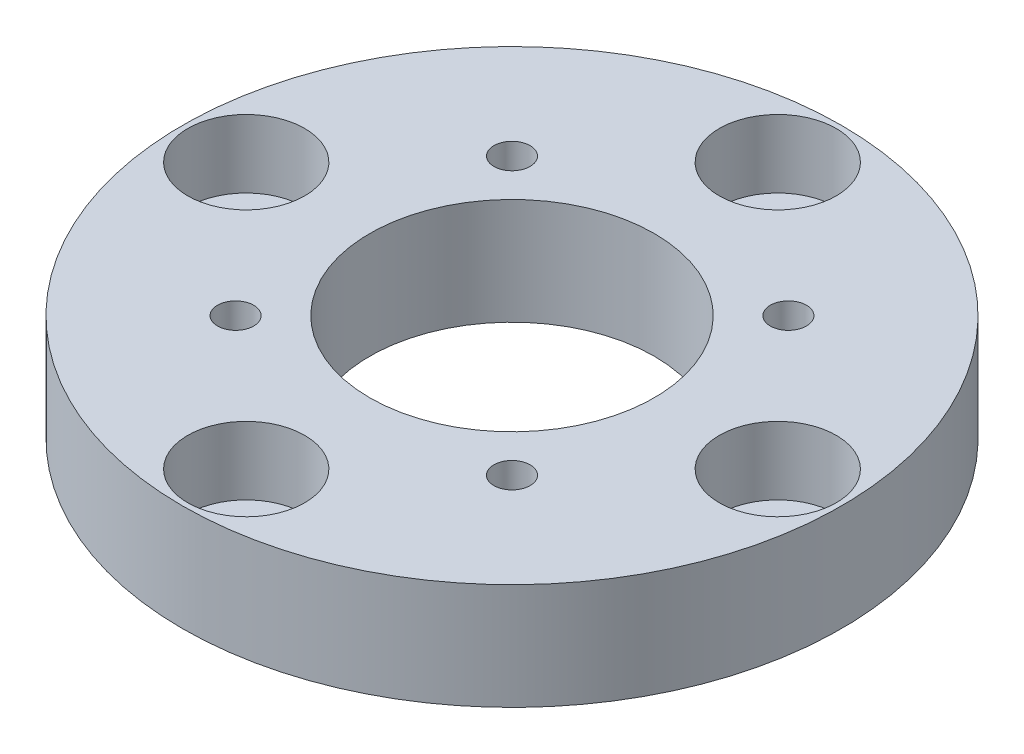
ISO-10303-21;
HEADER;
FILE_DESCRIPTION(('STEP AP214'),'2;1');
FILE_NAME('part.step','',(''),(''),'','','');
FILE_SCHEMA(('AUTOMOTIVE_DESIGN { 1 0 10303 214 1 1 1 1 }'));
ENDSEC;
DATA;
#1=APPLICATION_CONTEXT('core data for automotive mechanical design processes');
#2=APPLICATION_PROTOCOL_DEFINITION('international standard','automotive_design',2000,#1);
#3=PRODUCT_CONTEXT('',#1,'mechanical');
#4=PRODUCT('Part','Part','',(#3));
#5=PRODUCT_RELATED_PRODUCT_CATEGORY('part','',(#4));
#6=PRODUCT_DEFINITION_FORMATION('','',#4);
#7=PRODUCT_DEFINITION_CONTEXT('part definition',#1,'design');
#8=PRODUCT_DEFINITION('design','',#6,#7);
#9=PRODUCT_DEFINITION_SHAPE('','',#8);
#10=(LENGTH_UNIT() NAMED_UNIT(*) SI_UNIT(.MILLI.,.METRE.));
#11=(NAMED_UNIT(*) PLANE_ANGLE_UNIT() SI_UNIT($,.RADIAN.));
#12=(NAMED_UNIT(*) SI_UNIT($,.STERADIAN.) SOLID_ANGLE_UNIT());
#13=UNCERTAINTY_MEASURE_WITH_UNIT(LENGTH_MEASURE(1.E-05),#10,'distance_accuracy_value','');
#14=(GEOMETRIC_REPRESENTATION_CONTEXT(3) GLOBAL_UNCERTAINTY_ASSIGNED_CONTEXT((#13)) GLOBAL_UNIT_ASSIGNED_CONTEXT((#10,
#11,#12)) REPRESENTATION_CONTEXT('',''));
#15=CARTESIAN_POINT('',(0.,0.,0.));
#16=DIRECTION('',(0.,0.,1.));
#17=DIRECTION('',(1.,0.,0.));
#18=AXIS2_PLACEMENT_3D('',#15,#16,#17);
#19=CARTESIAN_POINT('',(0.,10.,0.));
#20=DIRECTION('',(0.,1.,0.));
#21=DIRECTION('',(0.,0.,1.));
#22=AXIS2_PLACEMENT_3D('',#19,#20,#21);
#23=PLANE('',#22);
#24=CARTESIAN_POINT('',(-12.9999999999999,10.,13.0000000000001));
#25=DIRECTION('',(0.,1.,0.));
#26=DIRECTION('',(1.,0.,0.));
#27=AXIS2_PLACEMENT_3D('',#24,#25,#26);
#28=CIRCLE('',#27,1.7);
#29=CARTESIAN_POINT('',(-11.2999999999999,10.,13.0000000000001));
#30=VERTEX_POINT('',#29);
#31=EDGE_CURVE('E87',#30,#30,#28,.T.);
#32=ORIENTED_EDGE('',*,*,#31,.F.);
#33=EDGE_LOOP('',(#32));
#34=FACE_BOUND('',#33,.T.);
#35=CARTESIAN_POINT('',(13.,10.,13.));
#36=DIRECTION('',(0.,1.,0.));
#37=DIRECTION('',(0.,0.,-1.));
#38=AXIS2_PLACEMENT_3D('',#35,#36,#37);
#39=CIRCLE('',#38,1.7);
#40=CARTESIAN_POINT('',(13.,10.,11.3));
#41=VERTEX_POINT('',#40);
#42=EDGE_CURVE('E117',#41,#41,#39,.T.);
#43=ORIENTED_EDGE('',*,*,#42,.F.);
#44=EDGE_LOOP('',(#43));
#45=FACE_BOUND('',#44,.T.);
#46=CARTESIAN_POINT('',(12.9999999999998,10.,-13.0000000000002));
#47=DIRECTION('',(0.,1.,0.));
#48=DIRECTION('',(-1.,0.,0.));
#49=AXIS2_PLACEMENT_3D('',#46,#47,#48);
#50=CIRCLE('',#49,1.7);
#51=CARTESIAN_POINT('',(11.2999999999998,10.,-13.0000000000001));
#52=VERTEX_POINT('',#51);
#53=EDGE_CURVE('E110',#52,#52,#50,.T.);
#54=ORIENTED_EDGE('',*,*,#53,.F.);
#55=EDGE_LOOP('',(#54));
#56=FACE_BOUND('',#55,.T.);
#57=CARTESIAN_POINT('',(-25.,10.,0.));
#58=DIRECTION('',(0.,1.,0.));
#59=DIRECTION('',(1.,0.,0.));
#60=AXIS2_PLACEMENT_3D('',#57,#58,#59);
#61=CIRCLE('',#60,5.5);
#62=CARTESIAN_POINT('',(-19.5,10.,0.));
#63=VERTEX_POINT('',#62);
#64=EDGE_CURVE('E91',#63,#63,#61,.T.);
#65=ORIENTED_EDGE('',*,*,#64,.F.);
#66=EDGE_LOOP('',(#65));
#67=FACE_BOUND('',#66,.T.);
#68=CARTESIAN_POINT('',(0.,10.,25.));
#69=DIRECTION('',(0.,1.,0.));
#70=DIRECTION('',(0.,0.,-1.));
#71=AXIS2_PLACEMENT_3D('',#68,#69,#70);
#72=CIRCLE('',#71,5.5);
#73=CARTESIAN_POINT('',(0.,10.,19.5));
#74=VERTEX_POINT('',#73);
#75=EDGE_CURVE('E77',#74,#74,#72,.T.);
#76=ORIENTED_EDGE('',*,*,#75,.F.);
#77=EDGE_LOOP('',(#76));
#78=FACE_BOUND('',#77,.T.);
#79=CARTESIAN_POINT('',(25.,10.,-2.61861100413235E-13));
#80=DIRECTION('',(0.,1.,0.));
#81=DIRECTION('',(-1.,0.,0.));
#82=AXIS2_PLACEMENT_3D('',#79,#80,#81);
#83=CIRCLE('',#82,5.5);
#84=CARTESIAN_POINT('',(19.5,10.,-2.04251658322323E-13));
#85=VERTEX_POINT('',#84);
#86=EDGE_CURVE('E84',#85,#85,#83,.T.);
#87=ORIENTED_EDGE('',*,*,#86,.F.);
#88=EDGE_LOOP('',(#87));
#89=FACE_BOUND('',#88,.T.);
#90=CARTESIAN_POINT('',(-13.,10.,-13.));
#91=DIRECTION('',(0.,1.,0.));
#92=DIRECTION('',(0.,0.,1.));
#93=AXIS2_PLACEMENT_3D('',#90,#91,#92);
#94=CIRCLE('',#93,1.7);
#95=CARTESIAN_POINT('',(-13.,10.,-11.3));
#96=VERTEX_POINT('',#95);
#97=EDGE_CURVE('E70',#96,#96,#94,.T.);
#98=ORIENTED_EDGE('',*,*,#97,.F.);
#99=EDGE_LOOP('',(#98));
#100=FACE_BOUND('',#99,.T.);
#101=CARTESIAN_POINT('',(0.,10.,-25.));
#102=DIRECTION('',(0.,1.,0.));
#103=DIRECTION('',(0.,0.,1.));
#104=AXIS2_PLACEMENT_3D('',#101,#102,#103);
#105=CIRCLE('',#104,5.5);
#106=CARTESIAN_POINT('',(0.,10.,-19.5));
#107=VERTEX_POINT('',#106);
#108=EDGE_CURVE('E64',#107,#107,#105,.T.);
#109=ORIENTED_EDGE('',*,*,#108,.F.);
#110=EDGE_LOOP('',(#109));
#111=FACE_BOUND('',#110,.T.);
#112=CARTESIAN_POINT('',(0.,10.,0.));
#113=DIRECTION('',(0.,1.,0.));
#114=DIRECTION('',(0.,0.,1.));
#115=AXIS2_PLACEMENT_3D('',#112,#113,#114);
#116=CIRCLE('',#115,31.);
#117=CARTESIAN_POINT('',(0.,10.,31.));
#118=VERTEX_POINT('',#117);
#119=EDGE_CURVE('E10',#118,#118,#116,.T.);
#120=ORIENTED_EDGE('',*,*,#119,.T.);
#121=EDGE_LOOP('',(#120));
#122=FACE_BOUND('',#121,.T.);
#123=CARTESIAN_POINT('',(0.,10.,0.));
#124=DIRECTION('',(0.,1.,0.));
#125=DIRECTION('',(0.,0.,1.));
#126=AXIS2_PLACEMENT_3D('',#123,#124,#125);
#127=CIRCLE('',#126,13.3847763108502);
#128=CARTESIAN_POINT('',(0.,10.,13.3847763108502));
#129=VERTEX_POINT('',#128);
#130=EDGE_CURVE('E48',#129,#129,#127,.T.);
#131=ORIENTED_EDGE('',*,*,#130,.F.);
#132=EDGE_LOOP('',(#131));
#133=FACE_BOUND('',#132,.T.);
#134=ADVANCED_FACE('F37',(#34,#45,#56,#67,#78,#89,#100,#111,#122,#133),#23,.T.);
#135=CARTESIAN_POINT('',(0.,0.,0.));
#136=DIRECTION('',(0.,1.,0.));
#137=DIRECTION('',(0.,0.,1.));
#138=AXIS2_PLACEMENT_3D('',#135,#136,#137);
#139=PLANE('',#138);
#140=CARTESIAN_POINT('',(-12.9999999999999,0.,13.0000000000001));
#141=DIRECTION('',(0.,1.,0.));
#142=DIRECTION('',(1.,0.,0.));
#143=AXIS2_PLACEMENT_3D('',#140,#141,#142);
#144=CIRCLE('',#143,1.7);
#145=CARTESIAN_POINT('',(-11.2999999999999,0.,13.0000000000001));
#146=VERTEX_POINT('',#145);
#147=EDGE_CURVE('E120',#146,#146,#144,.T.);
#148=ORIENTED_EDGE('',*,*,#147,.T.);
#149=EDGE_LOOP('',(#148));
#150=FACE_BOUND('',#149,.T.);
#151=CARTESIAN_POINT('',(13.,0.,13.));
#152=DIRECTION('',(0.,1.,0.));
#153=DIRECTION('',(0.,0.,-1.));
#154=AXIS2_PLACEMENT_3D('',#151,#152,#153);
#155=CIRCLE('',#154,1.7);
#156=CARTESIAN_POINT('',(13.,0.,11.3));
#157=VERTEX_POINT('',#156);
#158=EDGE_CURVE('E113',#157,#157,#155,.T.);
#159=ORIENTED_EDGE('',*,*,#158,.T.);
#160=EDGE_LOOP('',(#159));
#161=FACE_BOUND('',#160,.T.);
#162=CARTESIAN_POINT('',(12.9999999999998,0.,-13.0000000000002));
#163=DIRECTION('',(0.,1.,0.));
#164=DIRECTION('',(-1.,0.,0.));
#165=AXIS2_PLACEMENT_3D('',#162,#163,#164);
#166=CIRCLE('',#165,1.7);
#167=CARTESIAN_POINT('',(11.2999999999998,0.,-13.0000000000001));
#168=VERTEX_POINT('',#167);
#169=EDGE_CURVE('E114',#168,#168,#166,.T.);
#170=ORIENTED_EDGE('',*,*,#169,.T.);
#171=EDGE_LOOP('',(#170));
#172=FACE_BOUND('',#171,.T.);
#173=CARTESIAN_POINT('',(-25.,0.,0.));
#174=DIRECTION('',(0.,1.,0.));
#175=DIRECTION('',(1.,0.,0.));
#176=AXIS2_PLACEMENT_3D('',#173,#174,#175);
#177=CIRCLE('',#176,3.3);
#178=CARTESIAN_POINT('',(-21.7,0.,0.));
#179=VERTEX_POINT('',#178);
#180=EDGE_CURVE('E105',#179,#179,#177,.T.);
#181=ORIENTED_EDGE('',*,*,#180,.T.);
#182=EDGE_LOOP('',(#181));
#183=FACE_BOUND('',#182,.T.);
#184=CARTESIAN_POINT('',(0.,0.,25.));
#185=DIRECTION('',(0.,1.,0.));
#186=DIRECTION('',(0.,0.,-1.));
#187=AXIS2_PLACEMENT_3D('',#184,#185,#186);
#188=CIRCLE('',#187,3.3);
#189=CARTESIAN_POINT('',(0.,0.,21.7));
#190=VERTEX_POINT('',#189);
#191=EDGE_CURVE('E95',#190,#190,#188,.T.);
#192=ORIENTED_EDGE('',*,*,#191,.T.);
#193=EDGE_LOOP('',(#192));
#194=FACE_BOUND('',#193,.T.);
#195=CARTESIAN_POINT('',(25.,0.,-2.61861100413235E-13));
#196=DIRECTION('',(0.,1.,0.));
#197=DIRECTION('',(-1.,0.,0.));
#198=AXIS2_PLACEMENT_3D('',#195,#196,#197);
#199=CIRCLE('',#198,3.3);
#200=CARTESIAN_POINT('',(21.7,0.,-2.27295435158688E-13));
#201=VERTEX_POINT('',#200);
#202=EDGE_CURVE('E81',#201,#201,#199,.T.);
#203=ORIENTED_EDGE('',*,*,#202,.T.);
#204=EDGE_LOOP('',(#203));
#205=FACE_BOUND('',#204,.T.);
#206=CARTESIAN_POINT('',(-13.,0.,-13.));
#207=DIRECTION('',(0.,1.,0.));
#208=DIRECTION('',(0.,0.,1.));
#209=AXIS2_PLACEMENT_3D('',#206,#207,#208);
#210=CIRCLE('',#209,1.7);
#211=CARTESIAN_POINT('',(-13.,0.,-11.3));
#212=VERTEX_POINT('',#211);
#213=EDGE_CURVE('E67',#212,#212,#210,.T.);
#214=ORIENTED_EDGE('',*,*,#213,.T.);
#215=EDGE_LOOP('',(#214));
#216=FACE_BOUND('',#215,.T.);
#217=CARTESIAN_POINT('',(0.,0.,-25.));
#218=DIRECTION('',(0.,1.,0.));
#219=DIRECTION('',(0.,0.,1.));
#220=AXIS2_PLACEMENT_3D('',#217,#218,#219);
#221=CIRCLE('',#220,3.3);
#222=CARTESIAN_POINT('',(0.,0.,-21.7));
#223=VERTEX_POINT('',#222);
#224=EDGE_CURVE('E53',#223,#223,#221,.T.);
#225=ORIENTED_EDGE('',*,*,#224,.T.);
#226=EDGE_LOOP('',(#225));
#227=FACE_BOUND('',#226,.T.);
#228=CARTESIAN_POINT('',(0.,0.,0.));
#229=DIRECTION('',(0.,1.,0.));
#230=DIRECTION('',(0.,0.,1.));
#231=AXIS2_PLACEMENT_3D('',#228,#229,#230);
#232=CIRCLE('',#231,31.);
#233=CARTESIAN_POINT('',(0.,0.,31.));
#234=VERTEX_POINT('',#233);
#235=EDGE_CURVE('E41',#234,#234,#232,.T.);
#236=ORIENTED_EDGE('',*,*,#235,.F.);
#237=EDGE_LOOP('',(#236));
#238=FACE_BOUND('',#237,.T.);
#239=CARTESIAN_POINT('',(0.,0.,0.));
#240=DIRECTION('',(0.,1.,0.));
#241=DIRECTION('',(0.,0.,1.));
#242=AXIS2_PLACEMENT_3D('',#239,#240,#241);
#243=CIRCLE('',#242,13.3847763108502);
#244=CARTESIAN_POINT('',(0.,0.,13.3847763108502));
#245=VERTEX_POINT('',#244);
#246=EDGE_CURVE('E50',#245,#245,#243,.T.);
#247=ORIENTED_EDGE('',*,*,#246,.T.);
#248=EDGE_LOOP('',(#247));
#249=FACE_BOUND('',#248,.T.);
#250=ADVANCED_FACE('F128',(#150,#161,#172,#183,#194,#205,#216,#227,#238,#249),#139,.F.);
#251=CARTESIAN_POINT('',(0.,10.,0.));
#252=DIRECTION('',(0.,-1.,0.));
#253=DIRECTION('',(0.,0.,-1.));
#254=AXIS2_PLACEMENT_3D('',#251,#252,#253);
#255=CYLINDRICAL_SURFACE('',#254,31.);
#256=ORIENTED_EDGE('',*,*,#119,.F.);
#257=EDGE_LOOP('',(#256));
#258=FACE_BOUND('',#257,.T.);
#259=ORIENTED_EDGE('',*,*,#235,.T.);
#260=EDGE_LOOP('',(#259));
#261=FACE_BOUND('',#260,.T.);
#262=ADVANCED_FACE('F39',(#258,#261),#255,.T.);
#263=CARTESIAN_POINT('',(0.,10.,0.));
#264=DIRECTION('',(0.,-1.,0.));
#265=DIRECTION('',(0.,0.,-1.));
#266=AXIS2_PLACEMENT_3D('',#263,#264,#265);
#267=CYLINDRICAL_SURFACE('',#266,13.3847763108502);
#268=ORIENTED_EDGE('',*,*,#130,.T.);
#269=EDGE_LOOP('',(#268));
#270=FACE_BOUND('',#269,.T.);
#271=ORIENTED_EDGE('',*,*,#246,.F.);
#272=EDGE_LOOP('',(#271));
#273=FACE_BOUND('',#272,.T.);
#274=ADVANCED_FACE('F157',(#270,#273),#267,.F.);
#275=CARTESIAN_POINT('',(0.,10.,-25.));
#276=DIRECTION('',(0.,1.,0.));
#277=DIRECTION('',(0.,0.,1.));
#278=AXIS2_PLACEMENT_3D('',#275,#276,#277);
#279=CYLINDRICAL_SURFACE('',#278,3.3);
#280=ORIENTED_EDGE('',*,*,#224,.F.);
#281=EDGE_LOOP('',(#280));
#282=FACE_BOUND('',#281,.T.);
#283=CARTESIAN_POINT('',(0.,3.6,-25.));
#284=DIRECTION('',(0.,1.,0.));
#285=DIRECTION('',(0.,0.,1.));
#286=AXIS2_PLACEMENT_3D('',#283,#284,#285);
#287=CIRCLE('',#286,3.3);
#288=CARTESIAN_POINT('',(0.,3.6,-21.7));
#289=VERTEX_POINT('',#288);
#290=EDGE_CURVE('E58',#289,#289,#287,.T.);
#291=ORIENTED_EDGE('',*,*,#290,.T.);
#292=EDGE_LOOP('',(#291));
#293=FACE_BOUND('',#292,.T.);
#294=ADVANCED_FACE('F160',(#282,#293),#279,.F.);
#295=CARTESIAN_POINT('',(3.3,3.6,-25.));
#296=DIRECTION('',(0.,-1.,0.));
#297=DIRECTION('',(0.,0.,-1.));
#298=AXIS2_PLACEMENT_3D('',#295,#296,#297);
#299=PLANE('',#298);
#300=ORIENTED_EDGE('',*,*,#290,.F.);
#301=EDGE_LOOP('',(#300));
#302=FACE_BOUND('',#301,.T.);
#303=CARTESIAN_POINT('',(0.,3.6,-25.));
#304=DIRECTION('',(0.,1.,0.));
#305=DIRECTION('',(0.,0.,1.));
#306=AXIS2_PLACEMENT_3D('',#303,#304,#305);
#307=CIRCLE('',#306,5.5);
#308=CARTESIAN_POINT('',(0.,3.6,-19.5));
#309=VERTEX_POINT('',#308);
#310=EDGE_CURVE('E61',#309,#309,#307,.T.);
#311=ORIENTED_EDGE('',*,*,#310,.T.);
#312=EDGE_LOOP('',(#311));
#313=FACE_BOUND('',#312,.T.);
#314=ADVANCED_FACE('F172',(#302,#313),#299,.F.);
#315=CARTESIAN_POINT('',(0.,10.,-25.));
#316=DIRECTION('',(0.,1.,0.));
#317=DIRECTION('',(0.,0.,1.));
#318=AXIS2_PLACEMENT_3D('',#315,#316,#317);
#319=CYLINDRICAL_SURFACE('',#318,5.5);
#320=ORIENTED_EDGE('',*,*,#310,.F.);
#321=EDGE_LOOP('',(#320));
#322=FACE_BOUND('',#321,.T.);
#323=ORIENTED_EDGE('',*,*,#108,.T.);
#324=EDGE_LOOP('',(#323));
#325=FACE_BOUND('',#324,.T.);
#326=ADVANCED_FACE('F176',(#322,#325),#319,.F.);
#327=CARTESIAN_POINT('',(-13.,10.,-13.));
#328=DIRECTION('',(0.,1.,0.));
#329=DIRECTION('',(0.,0.,1.));
#330=AXIS2_PLACEMENT_3D('',#327,#328,#329);
#331=CYLINDRICAL_SURFACE('',#330,1.7);
#332=ORIENTED_EDGE('',*,*,#213,.F.);
#333=EDGE_LOOP('',(#332));
#334=FACE_BOUND('',#333,.T.);
#335=ORIENTED_EDGE('',*,*,#97,.T.);
#336=EDGE_LOOP('',(#335));
#337=FACE_BOUND('',#336,.T.);
#338=ADVANCED_FACE('F180',(#334,#337),#331,.F.);
#339=CARTESIAN_POINT('',(25.,10.,-2.61861100413235E-13));
#340=DIRECTION('',(0.,1.,0.));
#341=DIRECTION('',(-1.,0.,0.));
#342=AXIS2_PLACEMENT_3D('',#339,#340,#341);
#343=CYLINDRICAL_SURFACE('',#342,3.3);
#344=ORIENTED_EDGE('',*,*,#202,.F.);
#345=EDGE_LOOP('',(#344));
#346=FACE_BOUND('',#345,.T.);
#347=CARTESIAN_POINT('',(25.,3.6,-2.61861100413235E-13));
#348=DIRECTION('',(0.,1.,0.));
#349=DIRECTION('',(-1.,0.,0.));
#350=AXIS2_PLACEMENT_3D('',#347,#348,#349);
#351=CIRCLE('',#350,3.3);
#352=CARTESIAN_POINT('',(21.7,3.6,-2.27295435158688E-13));
#353=VERTEX_POINT('',#352);
#354=EDGE_CURVE('E74',#353,#353,#351,.T.);
#355=ORIENTED_EDGE('',*,*,#354,.T.);
#356=EDGE_LOOP('',(#355));
#357=FACE_BOUND('',#356,.T.);
#358=ADVANCED_FACE('F184',(#346,#357),#343,.F.);
#359=CARTESIAN_POINT('',(25.,3.6,3.29999999999974));
#360=DIRECTION('',(0.,-1.,0.));
#361=DIRECTION('',(1.,0.,0.));
#362=AXIS2_PLACEMENT_3D('',#359,#360,#361);
#363=PLANE('',#362);
#364=ORIENTED_EDGE('',*,*,#354,.F.);
#365=EDGE_LOOP('',(#364));
#366=FACE_BOUND('',#365,.T.);
#367=CARTESIAN_POINT('',(25.,3.6,-2.61861100413235E-13));
#368=DIRECTION('',(0.,1.,0.));
#369=DIRECTION('',(-1.,0.,0.));
#370=AXIS2_PLACEMENT_3D('',#367,#368,#369);
#371=CIRCLE('',#370,5.5);
#372=CARTESIAN_POINT('',(19.5,3.6,-2.04251658322323E-13));
#373=VERTEX_POINT('',#372);
#374=EDGE_CURVE('E78',#373,#373,#371,.T.);
#375=ORIENTED_EDGE('',*,*,#374,.T.);
#376=EDGE_LOOP('',(#375));
#377=FACE_BOUND('',#376,.T.);
#378=ADVANCED_FACE('F188',(#366,#377),#363,.F.);
#379=CARTESIAN_POINT('',(25.,10.,-2.61861100413235E-13));
#380=DIRECTION('',(0.,1.,0.));
#381=DIRECTION('',(-1.,0.,0.));
#382=AXIS2_PLACEMENT_3D('',#379,#380,#381);
#383=CYLINDRICAL_SURFACE('',#382,5.5);
#384=ORIENTED_EDGE('',*,*,#374,.F.);
#385=EDGE_LOOP('',(#384));
#386=FACE_BOUND('',#385,.T.);
#387=ORIENTED_EDGE('',*,*,#86,.T.);
#388=EDGE_LOOP('',(#387));
#389=FACE_BOUND('',#388,.T.);
#390=ADVANCED_FACE('F192',(#386,#389),#383,.F.);
#391=CARTESIAN_POINT('',(0.,10.,25.));
#392=DIRECTION('',(0.,1.,0.));
#393=DIRECTION('',(0.,0.,-1.));
#394=AXIS2_PLACEMENT_3D('',#391,#392,#393);
#395=CYLINDRICAL_SURFACE('',#394,3.3);
#396=ORIENTED_EDGE('',*,*,#191,.F.);
#397=EDGE_LOOP('',(#396));
#398=FACE_BOUND('',#397,.T.);
#399=CARTESIAN_POINT('',(0.,3.6,25.));
#400=DIRECTION('',(0.,1.,0.));
#401=DIRECTION('',(0.,0.,-1.));
#402=AXIS2_PLACEMENT_3D('',#399,#400,#401);
#403=CIRCLE('',#402,3.3);
#404=CARTESIAN_POINT('',(0.,3.6,21.7));
#405=VERTEX_POINT('',#404);
#406=EDGE_CURVE('E88',#405,#405,#403,.T.);
#407=ORIENTED_EDGE('',*,*,#406,.T.);
#408=EDGE_LOOP('',(#407));
#409=FACE_BOUND('',#408,.T.);
#410=ADVANCED_FACE('F196',(#398,#409),#395,.F.);
#411=CARTESIAN_POINT('',(-3.3,3.6,25.));
#412=DIRECTION('',(0.,-1.,0.));
#413=DIRECTION('',(0.,0.,1.));
#414=AXIS2_PLACEMENT_3D('',#411,#412,#413);
#415=PLANE('',#414);
#416=ORIENTED_EDGE('',*,*,#406,.F.);
#417=EDGE_LOOP('',(#416));
#418=FACE_BOUND('',#417,.T.);
#419=CARTESIAN_POINT('',(0.,3.6,25.));
#420=DIRECTION('',(0.,1.,0.));
#421=DIRECTION('',(0.,0.,-1.));
#422=AXIS2_PLACEMENT_3D('',#419,#420,#421);
#423=CIRCLE('',#422,5.5);
#424=CARTESIAN_POINT('',(0.,3.6,19.5));
#425=VERTEX_POINT('',#424);
#426=EDGE_CURVE('E92',#425,#425,#423,.T.);
#427=ORIENTED_EDGE('',*,*,#426,.T.);
#428=EDGE_LOOP('',(#427));
#429=FACE_BOUND('',#428,.T.);
#430=ADVANCED_FACE('F200',(#418,#429),#415,.F.);
#431=CARTESIAN_POINT('',(0.,10.,25.));
#432=DIRECTION('',(0.,1.,0.));
#433=DIRECTION('',(0.,0.,-1.));
#434=AXIS2_PLACEMENT_3D('',#431,#432,#433);
#435=CYLINDRICAL_SURFACE('',#434,5.5);
#436=ORIENTED_EDGE('',*,*,#426,.F.);
#437=EDGE_LOOP('',(#436));
#438=FACE_BOUND('',#437,.T.);
#439=ORIENTED_EDGE('',*,*,#75,.T.);
#440=EDGE_LOOP('',(#439));
#441=FACE_BOUND('',#440,.T.);
#442=ADVANCED_FACE('F204',(#438,#441),#435,.F.);
#443=CARTESIAN_POINT('',(-25.,10.,0.));
#444=DIRECTION('',(0.,1.,0.));
#445=DIRECTION('',(1.,0.,0.));
#446=AXIS2_PLACEMENT_3D('',#443,#444,#445);
#447=CYLINDRICAL_SURFACE('',#446,3.3);
#448=ORIENTED_EDGE('',*,*,#180,.F.);
#449=EDGE_LOOP('',(#448));
#450=FACE_BOUND('',#449,.T.);
#451=CARTESIAN_POINT('',(-25.,3.6,0.));
#452=DIRECTION('',(0.,1.,0.));
#453=DIRECTION('',(1.,0.,0.));
#454=AXIS2_PLACEMENT_3D('',#451,#452,#453);
#455=CIRCLE('',#454,3.3);
#456=CARTESIAN_POINT('',(-21.7,3.6,0.));
#457=VERTEX_POINT('',#456);
#458=EDGE_CURVE('E73',#457,#457,#455,.T.);
#459=ORIENTED_EDGE('',*,*,#458,.T.);
#460=EDGE_LOOP('',(#459));
#461=FACE_BOUND('',#460,.T.);
#462=ADVANCED_FACE('F208',(#450,#461),#447,.F.);
#463=CARTESIAN_POINT('',(-25.,3.6,-3.29999999999991));
#464=DIRECTION('',(0.,-1.,0.));
#465=DIRECTION('',(-1.,0.,0.));
#466=AXIS2_PLACEMENT_3D('',#463,#464,#465);
#467=PLANE('',#466);
#468=ORIENTED_EDGE('',*,*,#458,.F.);
#469=EDGE_LOOP('',(#468));
#470=FACE_BOUND('',#469,.T.);
#471=CARTESIAN_POINT('',(-25.,3.6,0.));
#472=DIRECTION('',(0.,1.,0.));
#473=DIRECTION('',(1.,0.,0.));
#474=AXIS2_PLACEMENT_3D('',#471,#472,#473);
#475=CIRCLE('',#474,5.5);
#476=CARTESIAN_POINT('',(-19.5,3.6,0.));
#477=VERTEX_POINT('',#476);
#478=EDGE_CURVE('E102',#477,#477,#475,.T.);
#479=ORIENTED_EDGE('',*,*,#478,.T.);
#480=EDGE_LOOP('',(#479));
#481=FACE_BOUND('',#480,.T.);
#482=ADVANCED_FACE('F212',(#470,#481),#467,.F.);
#483=CARTESIAN_POINT('',(-25.,10.,0.));
#484=DIRECTION('',(0.,1.,0.));
#485=DIRECTION('',(1.,0.,0.));
#486=AXIS2_PLACEMENT_3D('',#483,#484,#485);
#487=CYLINDRICAL_SURFACE('',#486,5.5);
#488=ORIENTED_EDGE('',*,*,#478,.F.);
#489=EDGE_LOOP('',(#488));
#490=FACE_BOUND('',#489,.T.);
#491=ORIENTED_EDGE('',*,*,#64,.T.);
#492=EDGE_LOOP('',(#491));
#493=FACE_BOUND('',#492,.T.);
#494=ADVANCED_FACE('F216',(#490,#493),#487,.F.);
#495=CARTESIAN_POINT('',(12.9999999999998,10.,-13.0000000000002));
#496=DIRECTION('',(0.,1.,0.));
#497=DIRECTION('',(-1.,0.,0.));
#498=AXIS2_PLACEMENT_3D('',#495,#496,#497);
#499=CYLINDRICAL_SURFACE('',#498,1.7);
#500=ORIENTED_EDGE('',*,*,#169,.F.);
#501=EDGE_LOOP('',(#500));
#502=FACE_BOUND('',#501,.T.);
#503=ORIENTED_EDGE('',*,*,#53,.T.);
#504=EDGE_LOOP('',(#503));
#505=FACE_BOUND('',#504,.T.);
#506=ADVANCED_FACE('F220',(#502,#505),#499,.F.);
#507=CARTESIAN_POINT('',(13.,10.,13.));
#508=DIRECTION('',(0.,1.,0.));
#509=DIRECTION('',(0.,0.,-1.));
#510=AXIS2_PLACEMENT_3D('',#507,#508,#509);
#511=CYLINDRICAL_SURFACE('',#510,1.7);
#512=ORIENTED_EDGE('',*,*,#158,.F.);
#513=EDGE_LOOP('',(#512));
#514=FACE_BOUND('',#513,.T.);
#515=ORIENTED_EDGE('',*,*,#42,.T.);
#516=EDGE_LOOP('',(#515));
#517=FACE_BOUND('',#516,.T.);
#518=ADVANCED_FACE('F134',(#514,#517),#511,.F.);
#519=CARTESIAN_POINT('',(-12.9999999999999,10.,13.0000000000001));
#520=DIRECTION('',(0.,1.,0.));
#521=DIRECTION('',(1.,0.,0.));
#522=AXIS2_PLACEMENT_3D('',#519,#520,#521);
#523=CYLINDRICAL_SURFACE('',#522,1.7);
#524=ORIENTED_EDGE('',*,*,#147,.F.);
#525=EDGE_LOOP('',(#524));
#526=FACE_BOUND('',#525,.T.);
#527=ORIENTED_EDGE('',*,*,#31,.T.);
#528=EDGE_LOOP('',(#527));
#529=FACE_BOUND('',#528,.T.);
#530=ADVANCED_FACE('F131',(#526,#529),#523,.F.);
#531=CLOSED_SHELL('',(#134,#250,#262,#274,#294,#314,#326,#338,#358,#378,#390,#410,#430,#442,
#462,#482,#494,#506,#518,#530));
#532=MANIFOLD_SOLID_BREP('B2',#531);
#533=ADVANCED_BREP_SHAPE_REPRESENTATION('',(#18,#532),#14);
#534=SHAPE_DEFINITION_REPRESENTATION(#9,#533);
ENDSEC;
END-ISO-10303-21;
